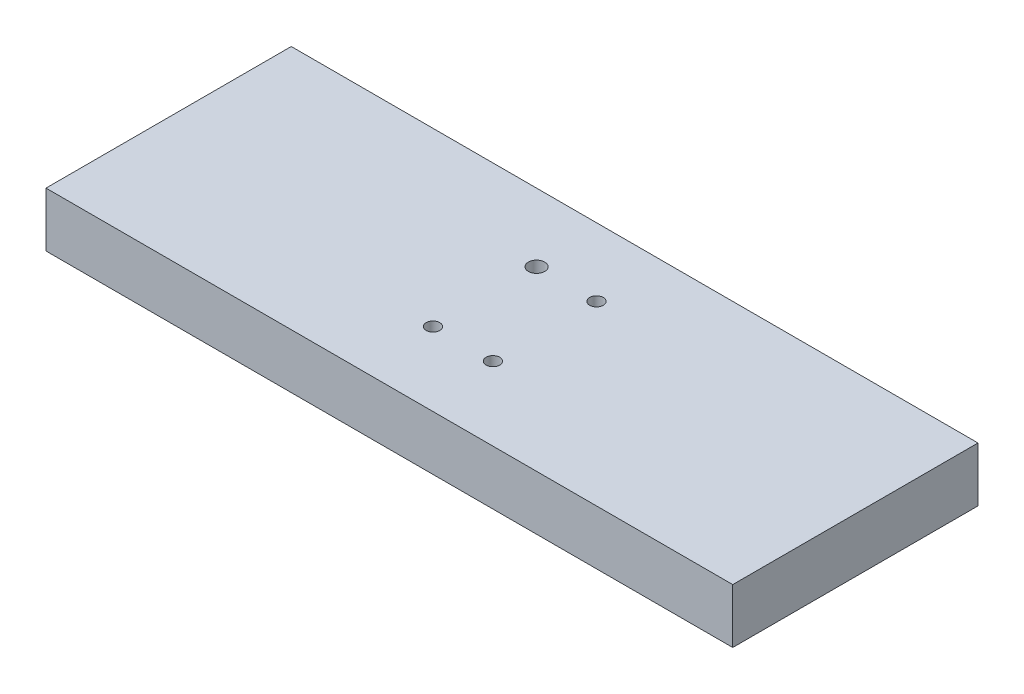
ISO-10303-21;
HEADER;
FILE_DESCRIPTION(('STEP AP214'),'2;1');
FILE_NAME('part.step','',(''),(''),'','','');
FILE_SCHEMA(('AUTOMOTIVE_DESIGN { 1 0 10303 214 1 1 1 1 }'));
ENDSEC;
DATA;
#1=APPLICATION_CONTEXT('core data for automotive mechanical design processes');
#2=APPLICATION_PROTOCOL_DEFINITION('international standard','automotive_design',2000,#1);
#3=PRODUCT_CONTEXT('',#1,'mechanical');
#4=PRODUCT('Part','Part','',(#3));
#5=PRODUCT_RELATED_PRODUCT_CATEGORY('part','',(#4));
#6=PRODUCT_DEFINITION_FORMATION('','',#4);
#7=PRODUCT_DEFINITION_CONTEXT('part definition',#1,'design');
#8=PRODUCT_DEFINITION('design','',#6,#7);
#9=PRODUCT_DEFINITION_SHAPE('','',#8);
#10=(LENGTH_UNIT() NAMED_UNIT(*) SI_UNIT(.MILLI.,.METRE.));
#11=(NAMED_UNIT(*) PLANE_ANGLE_UNIT() SI_UNIT($,.RADIAN.));
#12=(NAMED_UNIT(*) SI_UNIT($,.STERADIAN.) SOLID_ANGLE_UNIT());
#13=UNCERTAINTY_MEASURE_WITH_UNIT(LENGTH_MEASURE(1.E-05),#10,'distance_accuracy_value','');
#14=(GEOMETRIC_REPRESENTATION_CONTEXT(3) GLOBAL_UNCERTAINTY_ASSIGNED_CONTEXT((#13)) GLOBAL_UNIT_ASSIGNED_CONTEXT((#10,
#11,#12)) REPRESENTATION_CONTEXT('',''));
#15=CARTESIAN_POINT('',(0.,0.,0.));
#16=DIRECTION('',(0.,0.,1.));
#17=DIRECTION('',(1.,0.,0.));
#18=AXIS2_PLACEMENT_3D('',#15,#16,#17);
#19=CARTESIAN_POINT('',(-126.,20.,45.));
#20=DIRECTION('',(1.,0.,0.));
#21=DIRECTION('',(0.,0.,-1.));
#22=AXIS2_PLACEMENT_3D('',#19,#20,#21);
#23=PLANE('',#22);
#24=DIRECTION('',(0.,0.,1.));
#25=VECTOR('',#24,1.);
#26=CARTESIAN_POINT('',(-126.,0.,45.));
#27=LINE('',#26,#25);
#28=CARTESIAN_POINT('',(-126.,0.,-45.));
#29=VERTEX_POINT('',#28);
#30=CARTESIAN_POINT('',(-126.,0.,45.));
#31=VERTEX_POINT('',#30);
#32=EDGE_CURVE('E96',#29,#31,#27,.T.);
#33=ORIENTED_EDGE('',*,*,#32,.T.);
#34=DIRECTION('',(0.,-1.,0.));
#35=VECTOR('',#34,1.);
#36=CARTESIAN_POINT('',(-126.,20.,45.));
#37=LINE('',#36,#35);
#38=CARTESIAN_POINT('',(-126.,20.,45.));
#39=VERTEX_POINT('',#38);
#40=EDGE_CURVE('E11',#39,#31,#37,.T.);
#41=ORIENTED_EDGE('',*,*,#40,.F.);
#42=DIRECTION('',(0.,0.,1.));
#43=VECTOR('',#42,1.);
#44=CARTESIAN_POINT('',(-126.,20.,45.));
#45=LINE('',#44,#43);
#46=CARTESIAN_POINT('',(-126.,20.,-45.));
#47=VERTEX_POINT('',#46);
#48=EDGE_CURVE('E84',#47,#39,#45,.T.);
#49=ORIENTED_EDGE('',*,*,#48,.F.);
#50=DIRECTION('',(0.,-1.,0.));
#51=VECTOR('',#50,1.);
#52=CARTESIAN_POINT('',(-126.,20.,-45.));
#53=LINE('',#52,#51);
#54=EDGE_CURVE('E92',#47,#29,#53,.T.);
#55=ORIENTED_EDGE('',*,*,#54,.T.);
#56=EDGE_LOOP('',(#33,#41,#49,#55));
#57=FACE_BOUND('',#56,.T.);
#58=ADVANCED_FACE('F33',(#57),#23,.F.);
#59=CARTESIAN_POINT('',(126.,20.,45.));
#60=DIRECTION('',(0.,0.,-1.));
#61=DIRECTION('',(-1.,0.,0.));
#62=AXIS2_PLACEMENT_3D('',#59,#60,#61);
#63=PLANE('',#62);
#64=DIRECTION('',(1.,0.,0.));
#65=VECTOR('',#64,1.);
#66=CARTESIAN_POINT('',(126.,0.,45.));
#67=LINE('',#66,#65);
#68=CARTESIAN_POINT('',(126.,0.,45.));
#69=VERTEX_POINT('',#68);
#70=EDGE_CURVE('E88',#31,#69,#67,.T.);
#71=ORIENTED_EDGE('',*,*,#70,.T.);
#72=DIRECTION('',(0.,-1.,0.));
#73=VECTOR('',#72,1.);
#74=CARTESIAN_POINT('',(126.,20.,45.));
#75=LINE('',#74,#73);
#76=CARTESIAN_POINT('',(126.,20.,45.));
#77=VERTEX_POINT('',#76);
#78=EDGE_CURVE('E41',#77,#69,#75,.T.);
#79=ORIENTED_EDGE('',*,*,#78,.F.);
#80=DIRECTION('',(1.,0.,0.));
#81=VECTOR('',#80,1.);
#82=CARTESIAN_POINT('',(126.,20.,45.));
#83=LINE('',#82,#81);
#84=EDGE_CURVE('E79',#39,#77,#83,.T.);
#85=ORIENTED_EDGE('',*,*,#84,.F.);
#86=ORIENTED_EDGE('',*,*,#40,.T.);
#87=EDGE_LOOP('',(#71,#79,#85,#86));
#88=FACE_BOUND('',#87,.T.);
#89=ADVANCED_FACE('F87',(#88),#63,.F.);
#90=CARTESIAN_POINT('',(126.,20.,45.));
#91=DIRECTION('',(-1.,0.,0.));
#92=DIRECTION('',(0.,0.,1.));
#93=AXIS2_PLACEMENT_3D('',#90,#91,#92);
#94=PLANE('',#93);
#95=DIRECTION('',(0.,0.,-1.));
#96=VECTOR('',#95,1.);
#97=CARTESIAN_POINT('',(126.,0.,45.));
#98=LINE('',#97,#96);
#99=CARTESIAN_POINT('',(126.,0.,-45.));
#100=VERTEX_POINT('',#99);
#101=EDGE_CURVE('E66',#69,#100,#98,.T.);
#102=ORIENTED_EDGE('',*,*,#101,.T.);
#103=DIRECTION('',(0.,-1.,0.));
#104=VECTOR('',#103,1.);
#105=CARTESIAN_POINT('',(126.,20.,-45.));
#106=LINE('',#105,#104);
#107=CARTESIAN_POINT('',(126.,20.,-45.));
#108=VERTEX_POINT('',#107);
#109=EDGE_CURVE('E89',#108,#100,#106,.T.);
#110=ORIENTED_EDGE('',*,*,#109,.F.);
#111=DIRECTION('',(0.,0.,-1.));
#112=VECTOR('',#111,1.);
#113=CARTESIAN_POINT('',(126.,20.,45.));
#114=LINE('',#113,#112);
#115=EDGE_CURVE('E82',#77,#108,#114,.T.);
#116=ORIENTED_EDGE('',*,*,#115,.F.);
#117=ORIENTED_EDGE('',*,*,#78,.T.);
#118=EDGE_LOOP('',(#102,#110,#116,#117));
#119=FACE_BOUND('',#118,.T.);
#120=ADVANCED_FACE('F90',(#119),#94,.F.);
#121=CARTESIAN_POINT('',(126.,20.,-45.));
#122=DIRECTION('',(0.,0.,1.));
#123=DIRECTION('',(1.,0.,0.));
#124=AXIS2_PLACEMENT_3D('',#121,#122,#123);
#125=PLANE('',#124);
#126=DIRECTION('',(-1.,0.,0.));
#127=VECTOR('',#126,1.);
#128=CARTESIAN_POINT('',(126.,0.,-45.));
#129=LINE('',#128,#127);
#130=EDGE_CURVE('E72',#100,#29,#129,.T.);
#131=ORIENTED_EDGE('',*,*,#130,.T.);
#132=ORIENTED_EDGE('',*,*,#54,.F.);
#133=DIRECTION('',(-1.,0.,0.));
#134=VECTOR('',#133,1.);
#135=CARTESIAN_POINT('',(126.,20.,-45.));
#136=LINE('',#135,#134);
#137=EDGE_CURVE('E49',#108,#47,#136,.T.);
#138=ORIENTED_EDGE('',*,*,#137,.F.);
#139=ORIENTED_EDGE('',*,*,#109,.T.);
#140=EDGE_LOOP('',(#131,#132,#138,#139));
#141=FACE_BOUND('',#140,.T.);
#142=ADVANCED_FACE('F104',(#141),#125,.F.);
#143=CARTESIAN_POINT('',(0.,20.,0.));
#144=DIRECTION('',(0.,1.,0.));
#145=DIRECTION('',(0.,0.,1.));
#146=AXIS2_PLACEMENT_3D('',#143,#144,#145);
#147=PLANE('',#146);
#148=CARTESIAN_POINT('',(-10.999999992269,20.,17.9999999999987));
#149=DIRECTION('',(0.,1.,0.));
#150=DIRECTION('',(0.,0.,1.));
#151=AXIS2_PLACEMENT_3D('',#148,#149,#150);
#152=CIRCLE('',#151,2.49999999324964);
#153=CARTESIAN_POINT('',(-10.999999992269,20.,20.4999999932484));
#154=VERTEX_POINT('',#153);
#155=EDGE_CURVE('E128',#154,#154,#152,.T.);
#156=ORIENTED_EDGE('',*,*,#155,.F.);
#157=EDGE_LOOP('',(#156));
#158=FACE_BOUND('',#157,.T.);
#159=CARTESIAN_POINT('',(11.000000007731,20.,17.9999999999986));
#160=DIRECTION('',(0.,1.,0.));
#161=DIRECTION('',(0.,0.,1.));
#162=AXIS2_PLACEMENT_3D('',#159,#160,#161);
#163=CIRCLE('',#162,2.49999999324964);
#164=CARTESIAN_POINT('',(11.000000007731,20.,20.4999999932482));
#165=VERTEX_POINT('',#164);
#166=EDGE_CURVE('E122',#165,#165,#163,.T.);
#167=ORIENTED_EDGE('',*,*,#166,.F.);
#168=EDGE_LOOP('',(#167));
#169=FACE_BOUND('',#168,.T.);
#170=CARTESIAN_POINT('',(11.0000000077307,20.,-20.0000000000014));
#171=DIRECTION('',(0.,1.,0.));
#172=DIRECTION('',(0.,0.,1.));
#173=AXIS2_PLACEMENT_3D('',#170,#171,#172);
#174=CIRCLE('',#173,2.49999999324965);
#175=CARTESIAN_POINT('',(11.0000000077307,20.,-17.5000000067518));
#176=VERTEX_POINT('',#175);
#177=EDGE_CURVE('E116',#176,#176,#174,.T.);
#178=ORIENTED_EDGE('',*,*,#177,.F.);
#179=EDGE_LOOP('',(#178));
#180=FACE_BOUND('',#179,.T.);
#181=CARTESIAN_POINT('',(-10.9999999922691,20.,-20.0000000000013));
#182=DIRECTION('',(0.,1.,0.));
#183=DIRECTION('',(0.,0.,1.));
#184=AXIS2_PLACEMENT_3D('',#181,#182,#183);
#185=CIRCLE('',#184,2.99999999324966);
#186=CARTESIAN_POINT('',(-10.9999999922691,20.,-17.0000000067516));
#187=VERTEX_POINT('',#186);
#188=EDGE_CURVE('E110',#187,#187,#185,.T.);
#189=ORIENTED_EDGE('',*,*,#188,.F.);
#190=EDGE_LOOP('',(#189));
#191=FACE_BOUND('',#190,.T.);
#192=ORIENTED_EDGE('',*,*,#48,.T.);
#193=ORIENTED_EDGE('',*,*,#84,.T.);
#194=ORIENTED_EDGE('',*,*,#115,.T.);
#195=ORIENTED_EDGE('',*,*,#137,.T.);
#196=EDGE_LOOP('',(#192,#193,#194,#195));
#197=FACE_BOUND('',#196,.T.);
#198=ADVANCED_FACE('F80',(#158,#169,#180,#191,#197),#147,.T.);
#199=CARTESIAN_POINT('',(0.,0.,0.));
#200=DIRECTION('',(0.,1.,0.));
#201=DIRECTION('',(0.,0.,1.));
#202=AXIS2_PLACEMENT_3D('',#199,#200,#201);
#203=PLANE('',#202);
#204=CARTESIAN_POINT('',(-10.999999992269,0.,17.9999999999987));
#205=DIRECTION('',(0.,1.,0.));
#206=DIRECTION('',(0.,0.,1.));
#207=AXIS2_PLACEMENT_3D('',#204,#205,#206);
#208=CIRCLE('',#207,2.49999999324964);
#209=CARTESIAN_POINT('',(-10.999999992269,0.,20.4999999932484));
#210=VERTEX_POINT('',#209);
#211=EDGE_CURVE('E125',#210,#210,#208,.T.);
#212=ORIENTED_EDGE('',*,*,#211,.T.);
#213=EDGE_LOOP('',(#212));
#214=FACE_BOUND('',#213,.T.);
#215=CARTESIAN_POINT('',(11.000000007731,0.,17.9999999999986));
#216=DIRECTION('',(0.,1.,0.));
#217=DIRECTION('',(0.,0.,1.));
#218=AXIS2_PLACEMENT_3D('',#215,#216,#217);
#219=CIRCLE('',#218,2.49999999324964);
#220=CARTESIAN_POINT('',(11.000000007731,0.,20.4999999932482));
#221=VERTEX_POINT('',#220);
#222=EDGE_CURVE('E119',#221,#221,#219,.T.);
#223=ORIENTED_EDGE('',*,*,#222,.T.);
#224=EDGE_LOOP('',(#223));
#225=FACE_BOUND('',#224,.T.);
#226=CARTESIAN_POINT('',(11.0000000077307,0.,-20.0000000000014));
#227=DIRECTION('',(0.,1.,0.));
#228=DIRECTION('',(0.,0.,1.));
#229=AXIS2_PLACEMENT_3D('',#226,#227,#228);
#230=CIRCLE('',#229,2.49999999324965);
#231=CARTESIAN_POINT('',(11.0000000077307,0.,-17.5000000067518));
#232=VERTEX_POINT('',#231);
#233=EDGE_CURVE('E113',#232,#232,#230,.T.);
#234=ORIENTED_EDGE('',*,*,#233,.T.);
#235=EDGE_LOOP('',(#234));
#236=FACE_BOUND('',#235,.T.);
#237=CARTESIAN_POINT('',(-10.9999999922691,0.,-20.0000000000013));
#238=DIRECTION('',(0.,1.,0.));
#239=DIRECTION('',(0.,0.,1.));
#240=AXIS2_PLACEMENT_3D('',#237,#238,#239);
#241=CIRCLE('',#240,2.99999999324966);
#242=CARTESIAN_POINT('',(-10.9999999922691,0.,-17.0000000067516));
#243=VERTEX_POINT('',#242);
#244=EDGE_CURVE('E99',#243,#243,#241,.T.);
#245=ORIENTED_EDGE('',*,*,#244,.T.);
#246=EDGE_LOOP('',(#245));
#247=FACE_BOUND('',#246,.T.);
#248=ORIENTED_EDGE('',*,*,#32,.F.);
#249=ORIENTED_EDGE('',*,*,#130,.F.);
#250=ORIENTED_EDGE('',*,*,#101,.F.);
#251=ORIENTED_EDGE('',*,*,#70,.F.);
#252=EDGE_LOOP('',(#248,#249,#250,#251));
#253=FACE_BOUND('',#252,.T.);
#254=ADVANCED_FACE('F107',(#214,#225,#236,#247,#253),#203,.F.);
#255=CARTESIAN_POINT('',(-10.9999999922691,0.,-20.0000000000013));
#256=DIRECTION('',(0.,1.,0.));
#257=DIRECTION('',(0.,0.,1.));
#258=AXIS2_PLACEMENT_3D('',#255,#256,#257);
#259=CYLINDRICAL_SURFACE('',#258,2.99999999324966);
#260=ORIENTED_EDGE('',*,*,#244,.F.);
#261=EDGE_LOOP('',(#260));
#262=FACE_BOUND('',#261,.T.);
#263=ORIENTED_EDGE('',*,*,#188,.T.);
#264=EDGE_LOOP('',(#263));
#265=FACE_BOUND('',#264,.T.);
#266=ADVANCED_FACE('F152',(#262,#265),#259,.F.);
#267=CARTESIAN_POINT('',(11.0000000077307,0.,-20.0000000000014));
#268=DIRECTION('',(0.,1.,0.));
#269=DIRECTION('',(0.,0.,1.));
#270=AXIS2_PLACEMENT_3D('',#267,#268,#269);
#271=CYLINDRICAL_SURFACE('',#270,2.49999999324965);
#272=ORIENTED_EDGE('',*,*,#233,.F.);
#273=EDGE_LOOP('',(#272));
#274=FACE_BOUND('',#273,.T.);
#275=ORIENTED_EDGE('',*,*,#177,.T.);
#276=EDGE_LOOP('',(#275));
#277=FACE_BOUND('',#276,.T.);
#278=ADVANCED_FACE('F154',(#274,#277),#271,.F.);
#279=CARTESIAN_POINT('',(11.000000007731,0.,17.9999999999986));
#280=DIRECTION('',(0.,1.,0.));
#281=DIRECTION('',(0.,0.,1.));
#282=AXIS2_PLACEMENT_3D('',#279,#280,#281);
#283=CYLINDRICAL_SURFACE('',#282,2.49999999324964);
#284=ORIENTED_EDGE('',*,*,#222,.F.);
#285=EDGE_LOOP('',(#284));
#286=FACE_BOUND('',#285,.T.);
#287=ORIENTED_EDGE('',*,*,#166,.T.);
#288=EDGE_LOOP('',(#287));
#289=FACE_BOUND('',#288,.T.);
#290=ADVANCED_FACE('F139',(#286,#289),#283,.F.);
#291=CARTESIAN_POINT('',(-10.999999992269,0.,17.9999999999987));
#292=DIRECTION('',(0.,1.,0.));
#293=DIRECTION('',(0.,0.,1.));
#294=AXIS2_PLACEMENT_3D('',#291,#292,#293);
#295=CYLINDRICAL_SURFACE('',#294,2.49999999324964);
#296=ORIENTED_EDGE('',*,*,#211,.F.);
#297=EDGE_LOOP('',(#296));
#298=FACE_BOUND('',#297,.T.);
#299=ORIENTED_EDGE('',*,*,#155,.T.);
#300=EDGE_LOOP('',(#299));
#301=FACE_BOUND('',#300,.T.);
#302=ADVANCED_FACE('F136',(#298,#301),#295,.F.);
#303=CLOSED_SHELL('',(#58,#89,#120,#142,#198,#254,#266,#278,#290,#302));
#304=MANIFOLD_SOLID_BREP('B2',#303);
#305=ADVANCED_BREP_SHAPE_REPRESENTATION('',(#18,#304),#14);
#306=SHAPE_DEFINITION_REPRESENTATION(#9,#305);
ENDSEC;
END-ISO-10303-21;
